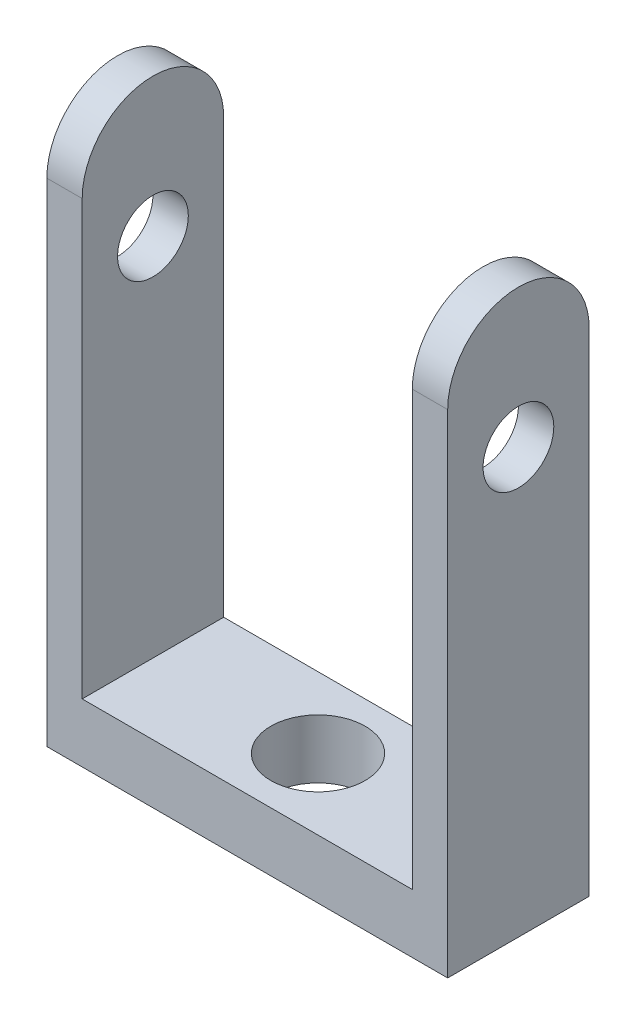
ISO-10303-21;
HEADER;
FILE_DESCRIPTION(('STEP AP214'),'2;1');
FILE_NAME('part.step','',(''),(''),'','','');
FILE_SCHEMA(('AUTOMOTIVE_DESIGN { 1 0 10303 214 1 1 1 1 }'));
ENDSEC;
DATA;
#1=APPLICATION_CONTEXT('core data for automotive mechanical design processes');
#2=APPLICATION_PROTOCOL_DEFINITION('international standard','automotive_design',2000,#1);
#3=PRODUCT_CONTEXT('',#1,'mechanical');
#4=PRODUCT('Part','Part','',(#3));
#5=PRODUCT_RELATED_PRODUCT_CATEGORY('part','',(#4));
#6=PRODUCT_DEFINITION_FORMATION('','',#4);
#7=PRODUCT_DEFINITION_CONTEXT('part definition',#1,'design');
#8=PRODUCT_DEFINITION('design','',#6,#7);
#9=PRODUCT_DEFINITION_SHAPE('','',#8);
#10=(LENGTH_UNIT() NAMED_UNIT(*) SI_UNIT(.MILLI.,.METRE.));
#11=(NAMED_UNIT(*) PLANE_ANGLE_UNIT() SI_UNIT($,.RADIAN.));
#12=(NAMED_UNIT(*) SI_UNIT($,.STERADIAN.) SOLID_ANGLE_UNIT());
#13=UNCERTAINTY_MEASURE_WITH_UNIT(LENGTH_MEASURE(1.E-05),#10,'distance_accuracy_value','');
#14=(GEOMETRIC_REPRESENTATION_CONTEXT(3) GLOBAL_UNCERTAINTY_ASSIGNED_CONTEXT((#13)) GLOBAL_UNIT_ASSIGNED_CONTEXT((#10,
#11,#12)) REPRESENTATION_CONTEXT('',''));
#15=CARTESIAN_POINT('',(0.,0.,0.));
#16=DIRECTION('',(0.,0.,1.));
#17=DIRECTION('',(1.,0.,0.));
#18=AXIS2_PLACEMENT_3D('',#15,#16,#17);
#19=CARTESIAN_POINT('',(17.,5.,6.));
#20=DIRECTION('',(-1.,0.,0.));
#21=DIRECTION('',(0.,0.,1.));
#22=AXIS2_PLACEMENT_3D('',#19,#20,#21);
#23=PLANE('',#22);
#24=DIRECTION('',(0.,0.,-1.));
#25=VECTOR('',#24,1.);
#26=CARTESIAN_POINT('',(17.,0.,6.));
#27=LINE('',#26,#25);
#28=CARTESIAN_POINT('',(17.,0.,6.));
#29=VERTEX_POINT('',#28);
#30=CARTESIAN_POINT('',(17.,0.,-6.));
#31=VERTEX_POINT('',#30);
#32=EDGE_CURVE('E179',#29,#31,#27,.T.);
#33=ORIENTED_EDGE('',*,*,#32,.T.);
#34=DIRECTION('',(0.,-1.,0.));
#35=VECTOR('',#34,1.);
#36=CARTESIAN_POINT('',(17.,5.,-6.));
#37=LINE('',#36,#35);
#38=CARTESIAN_POINT('',(17.,41.7522367722957,-6.));
#39=VERTEX_POINT('',#38);
#40=EDGE_CURVE('E11',#39,#31,#37,.T.);
#41=ORIENTED_EDGE('',*,*,#40,.F.);
#42=CARTESIAN_POINT('',(17.,41.7522367722957,0.));
#43=DIRECTION('',(1.,0.,0.));
#44=DIRECTION('',(0.,0.,1.));
#45=AXIS2_PLACEMENT_3D('',#42,#43,#44);
#46=CIRCLE('',#45,6.);
#47=CARTESIAN_POINT('',(17.,41.7522367722957,6.));
#48=VERTEX_POINT('',#47);
#49=EDGE_CURVE('E155',#39,#48,#46,.T.);
#50=ORIENTED_EDGE('',*,*,#49,.T.);
#51=DIRECTION('',(0.,-1.,0.));
#52=VECTOR('',#51,1.);
#53=CARTESIAN_POINT('',(17.,5.,6.));
#54=LINE('',#53,#52);
#55=EDGE_CURVE('E188',#48,#29,#54,.T.);
#56=ORIENTED_EDGE('',*,*,#55,.T.);
#57=EDGE_LOOP('',(#33,#41,#50,#56));
#58=FACE_BOUND('',#57,.T.);
#59=CARTESIAN_POINT('',(17.,36.,0.));
#60=DIRECTION('',(1.,0.,0.));
#61=DIRECTION('',(0.,0.,-1.));
#62=AXIS2_PLACEMENT_3D('',#59,#60,#61);
#63=CIRCLE('',#62,3.);
#64=CARTESIAN_POINT('',(17.,36.,-3.));
#65=VERTEX_POINT('',#64);
#66=EDGE_CURVE('E147',#65,#65,#63,.T.);
#67=ORIENTED_EDGE('',*,*,#66,.F.);
#68=EDGE_LOOP('',(#67));
#69=FACE_BOUND('',#68,.T.);
#70=ADVANCED_FACE('F39',(#58,#69),#23,.F.);
#71=CARTESIAN_POINT('',(-17.,5.,-6.));
#72=DIRECTION('',(0.,0.,1.));
#73=DIRECTION('',(1.,0.,0.));
#74=AXIS2_PLACEMENT_3D('',#71,#72,#73);
#75=PLANE('',#74);
#76=DIRECTION('',(-1.,0.,0.));
#77=VECTOR('',#76,1.);
#78=CARTESIAN_POINT('',(-17.,0.,-6.));
#79=LINE('',#78,#77);
#80=CARTESIAN_POINT('',(-17.,0.,-6.));
#81=VERTEX_POINT('',#80);
#82=EDGE_CURVE('E192',#31,#81,#79,.T.);
#83=ORIENTED_EDGE('',*,*,#82,.T.);
#84=DIRECTION('',(0.,-1.,0.));
#85=VECTOR('',#84,1.);
#86=CARTESIAN_POINT('',(-17.,5.,-6.));
#87=LINE('',#86,#85);
#88=CARTESIAN_POINT('',(-17.,41.7522367722957,-6.));
#89=VERTEX_POINT('',#88);
#90=EDGE_CURVE('E47',#89,#81,#87,.T.);
#91=ORIENTED_EDGE('',*,*,#90,.F.);
#92=DIRECTION('',(-1.,0.,0.));
#93=VECTOR('',#92,1.);
#94=CARTESIAN_POINT('',(-14.,41.7522367722957,-6.));
#95=LINE('',#94,#93);
#96=CARTESIAN_POINT('',(-14.,41.7522367722957,-6.));
#97=VERTEX_POINT('',#96);
#98=EDGE_CURVE('E133',#97,#89,#95,.T.);
#99=ORIENTED_EDGE('',*,*,#98,.F.);
#100=DIRECTION('',(0.,1.,0.));
#101=VECTOR('',#100,1.);
#102=CARTESIAN_POINT('',(-14.,41.7522367722957,-6.));
#103=LINE('',#102,#101);
#104=CARTESIAN_POINT('',(-14.,5.,-6.));
#105=VERTEX_POINT('',#104);
#106=EDGE_CURVE('E123',#105,#97,#103,.T.);
#107=ORIENTED_EDGE('',*,*,#106,.F.);
#108=DIRECTION('',(-1.,0.,0.));
#109=VECTOR('',#108,1.);
#110=CARTESIAN_POINT('',(-17.,5.,-6.));
#111=LINE('',#110,#109);
#112=CARTESIAN_POINT('',(14.,5.,-6.));
#113=VERTEX_POINT('',#112);
#114=EDGE_CURVE('E54',#113,#105,#111,.T.);
#115=ORIENTED_EDGE('',*,*,#114,.F.);
#116=DIRECTION('',(0.,1.,0.));
#117=VECTOR('',#116,1.);
#118=CARTESIAN_POINT('',(14.,5.,-6.));
#119=LINE('',#118,#117);
#120=CARTESIAN_POINT('',(14.,41.7522367722957,-6.));
#121=VERTEX_POINT('',#120);
#122=EDGE_CURVE('E62',#113,#121,#119,.T.);
#123=ORIENTED_EDGE('',*,*,#122,.T.);
#124=DIRECTION('',(1.,0.,0.));
#125=VECTOR('',#124,1.);
#126=CARTESIAN_POINT('',(14.,41.7522367722957,-6.));
#127=LINE('',#126,#125);
#128=EDGE_CURVE('E171',#121,#39,#127,.T.);
#129=ORIENTED_EDGE('',*,*,#128,.T.);
#130=ORIENTED_EDGE('',*,*,#40,.T.);
#131=EDGE_LOOP('',(#83,#91,#99,#107,#115,#123,#129,#130));
#132=FACE_BOUND('',#131,.T.);
#133=ADVANCED_FACE('F225',(#132),#75,.F.);
#134=CARTESIAN_POINT('',(-17.,5.,6.));
#135=DIRECTION('',(1.,0.,0.));
#136=DIRECTION('',(0.,0.,-1.));
#137=AXIS2_PLACEMENT_3D('',#134,#135,#136);
#138=PLANE('',#137);
#139=DIRECTION('',(0.,0.,1.));
#140=VECTOR('',#139,1.);
#141=CARTESIAN_POINT('',(-17.,0.,6.));
#142=LINE('',#141,#140);
#143=CARTESIAN_POINT('',(-17.,0.,6.));
#144=VERTEX_POINT('',#143);
#145=EDGE_CURVE('E195',#81,#144,#142,.T.);
#146=ORIENTED_EDGE('',*,*,#145,.T.);
#147=DIRECTION('',(0.,-1.,0.));
#148=VECTOR('',#147,1.);
#149=CARTESIAN_POINT('',(-17.,5.,6.));
#150=LINE('',#149,#148);
#151=CARTESIAN_POINT('',(-17.,41.7522367722957,6.));
#152=VERTEX_POINT('',#151);
#153=EDGE_CURVE('E203',#152,#144,#150,.T.);
#154=ORIENTED_EDGE('',*,*,#153,.F.);
#155=CARTESIAN_POINT('',(-17.,41.7522367722957,0.));
#156=DIRECTION('',(1.,0.,0.));
#157=DIRECTION('',(0.,0.,1.));
#158=AXIS2_PLACEMENT_3D('',#155,#156,#157);
#159=CIRCLE('',#158,6.);
#160=EDGE_CURVE('E118',#89,#152,#159,.T.);
#161=ORIENTED_EDGE('',*,*,#160,.F.);
#162=ORIENTED_EDGE('',*,*,#90,.T.);
#163=EDGE_LOOP('',(#146,#154,#161,#162));
#164=FACE_BOUND('',#163,.T.);
#165=CARTESIAN_POINT('',(-17.,36.,0.));
#166=DIRECTION('',(1.,0.,0.));
#167=DIRECTION('',(0.,0.,-1.));
#168=AXIS2_PLACEMENT_3D('',#165,#166,#167);
#169=CIRCLE('',#168,3.);
#170=CARTESIAN_POINT('',(-17.,36.,-3.));
#171=VERTEX_POINT('',#170);
#172=EDGE_CURVE('E232',#171,#171,#169,.T.);
#173=ORIENTED_EDGE('',*,*,#172,.T.);
#174=EDGE_LOOP('',(#173));
#175=FACE_BOUND('',#174,.T.);
#176=ADVANCED_FACE('F209',(#164,#175),#138,.F.);
#177=CARTESIAN_POINT('',(-17.,5.,6.));
#178=DIRECTION('',(0.,0.,-1.));
#179=DIRECTION('',(-1.,0.,0.));
#180=AXIS2_PLACEMENT_3D('',#177,#178,#179);
#181=PLANE('',#180);
#182=DIRECTION('',(1.,0.,0.));
#183=VECTOR('',#182,1.);
#184=CARTESIAN_POINT('',(-17.,0.,6.));
#185=LINE('',#184,#183);
#186=EDGE_CURVE('E185',#144,#29,#185,.T.);
#187=ORIENTED_EDGE('',*,*,#186,.T.);
#188=ORIENTED_EDGE('',*,*,#55,.F.);
#189=DIRECTION('',(1.,0.,0.));
#190=VECTOR('',#189,1.);
#191=CARTESIAN_POINT('',(14.,41.7522367722957,6.));
#192=LINE('',#191,#190);
#193=CARTESIAN_POINT('',(14.,41.7522367722957,6.));
#194=VERTEX_POINT('',#193);
#195=EDGE_CURVE('E175',#194,#48,#192,.T.);
#196=ORIENTED_EDGE('',*,*,#195,.F.);
#197=DIRECTION('',(0.,-1.,0.));
#198=VECTOR('',#197,1.);
#199=CARTESIAN_POINT('',(14.,5.,6.));
#200=LINE('',#199,#198);
#201=CARTESIAN_POINT('',(14.,5.,6.));
#202=VERTEX_POINT('',#201);
#203=EDGE_CURVE('E159',#194,#202,#200,.T.);
#204=ORIENTED_EDGE('',*,*,#203,.T.);
#205=DIRECTION('',(1.,0.,0.));
#206=VECTOR('',#205,1.);
#207=CARTESIAN_POINT('',(-17.,5.,6.));
#208=LINE('',#207,#206);
#209=CARTESIAN_POINT('',(-14.,5.,6.));
#210=VERTEX_POINT('',#209);
#211=EDGE_CURVE('E113',#210,#202,#208,.T.);
#212=ORIENTED_EDGE('',*,*,#211,.F.);
#213=DIRECTION('',(0.,-1.,0.));
#214=VECTOR('',#213,1.);
#215=CARTESIAN_POINT('',(-14.,5.,6.));
#216=LINE('',#215,#214);
#217=CARTESIAN_POINT('',(-14.,41.7522367722957,6.));
#218=VERTEX_POINT('',#217);
#219=EDGE_CURVE('E106',#218,#210,#216,.T.);
#220=ORIENTED_EDGE('',*,*,#219,.F.);
#221=DIRECTION('',(-1.,0.,0.));
#222=VECTOR('',#221,1.);
#223=CARTESIAN_POINT('',(-14.,41.7522367722957,6.));
#224=LINE('',#223,#222);
#225=EDGE_CURVE('E111',#218,#152,#224,.T.);
#226=ORIENTED_EDGE('',*,*,#225,.T.);
#227=ORIENTED_EDGE('',*,*,#153,.T.);
#228=EDGE_LOOP('',(#187,#188,#196,#204,#212,#220,#226,#227));
#229=FACE_BOUND('',#228,.T.);
#230=ADVANCED_FACE('F108',(#229),#181,.F.);
#231=CARTESIAN_POINT('',(0.,5.,0.));
#232=DIRECTION('',(0.,-1.,0.));
#233=DIRECTION('',(0.,0.,-1.));
#234=AXIS2_PLACEMENT_3D('',#231,#232,#233);
#235=PLANE('',#234);
#236=CARTESIAN_POINT('',(0.,5.,0.));
#237=DIRECTION('',(0.,1.,0.));
#238=DIRECTION('',(0.,0.,1.));
#239=AXIS2_PLACEMENT_3D('',#236,#237,#238);
#240=CIRCLE('',#239,4.);
#241=CARTESIAN_POINT('',(0.,5.,4.));
#242=VERTEX_POINT('',#241);
#243=EDGE_CURVE('E138',#242,#242,#240,.T.);
#244=ORIENTED_EDGE('',*,*,#243,.F.);
#245=EDGE_LOOP('',(#244));
#246=FACE_BOUND('',#245,.T.);
#247=ORIENTED_EDGE('',*,*,#114,.T.);
#248=DIRECTION('',(0.,0.,-1.));
#249=VECTOR('',#248,1.);
#250=CARTESIAN_POINT('',(-14.,5.,6.));
#251=LINE('',#250,#249);
#252=EDGE_CURVE('E134',#210,#105,#251,.T.);
#253=ORIENTED_EDGE('',*,*,#252,.F.);
#254=ORIENTED_EDGE('',*,*,#211,.T.);
#255=DIRECTION('',(0.,0.,-1.));
#256=VECTOR('',#255,1.);
#257=CARTESIAN_POINT('',(14.,5.,6.));
#258=LINE('',#257,#256);
#259=EDGE_CURVE('E162',#202,#113,#258,.T.);
#260=ORIENTED_EDGE('',*,*,#259,.T.);
#261=EDGE_LOOP('',(#247,#253,#254,#260));
#262=FACE_BOUND('',#261,.T.);
#263=ADVANCED_FACE('F224',(#246,#262),#235,.F.);
#264=CARTESIAN_POINT('',(0.,0.,0.));
#265=DIRECTION('',(0.,-1.,0.));
#266=DIRECTION('',(0.,0.,-1.));
#267=AXIS2_PLACEMENT_3D('',#264,#265,#266);
#268=PLANE('',#267);
#269=CARTESIAN_POINT('',(0.,0.,0.));
#270=DIRECTION('',(0.,1.,0.));
#271=DIRECTION('',(0.,0.,1.));
#272=AXIS2_PLACEMENT_3D('',#269,#270,#271);
#273=CIRCLE('',#272,4.);
#274=CARTESIAN_POINT('',(0.,0.,4.));
#275=VERTEX_POINT('',#274);
#276=EDGE_CURVE('E143',#275,#275,#273,.T.);
#277=ORIENTED_EDGE('',*,*,#276,.T.);
#278=EDGE_LOOP('',(#277));
#279=FACE_BOUND('',#278,.T.);
#280=ORIENTED_EDGE('',*,*,#32,.F.);
#281=ORIENTED_EDGE('',*,*,#186,.F.);
#282=ORIENTED_EDGE('',*,*,#145,.F.);
#283=ORIENTED_EDGE('',*,*,#82,.F.);
#284=EDGE_LOOP('',(#280,#281,#282,#283));
#285=FACE_BOUND('',#284,.T.);
#286=ADVANCED_FACE('F215',(#279,#285),#268,.T.);
#287=CARTESIAN_POINT('',(14.,41.7522367722957,0.));
#288=DIRECTION('',(1.,0.,0.));
#289=DIRECTION('',(0.,0.,-1.));
#290=AXIS2_PLACEMENT_3D('',#287,#288,#289);
#291=CYLINDRICAL_SURFACE('',#290,6.);
#292=ORIENTED_EDGE('',*,*,#49,.F.);
#293=ORIENTED_EDGE('',*,*,#128,.F.);
#294=CARTESIAN_POINT('',(14.,41.7522367722957,0.));
#295=DIRECTION('',(1.,0.,0.));
#296=DIRECTION('',(0.,0.,1.));
#297=AXIS2_PLACEMENT_3D('',#294,#295,#296);
#298=CIRCLE('',#297,6.);
#299=EDGE_CURVE('E167',#121,#194,#298,.T.);
#300=ORIENTED_EDGE('',*,*,#299,.T.);
#301=ORIENTED_EDGE('',*,*,#195,.T.);
#302=EDGE_LOOP('',(#292,#293,#300,#301));
#303=FACE_BOUND('',#302,.T.);
#304=ADVANCED_FACE('F222',(#303),#291,.T.);
#305=CARTESIAN_POINT('',(14.,41.7522367722957,0.));
#306=DIRECTION('',(-1.,0.,0.));
#307=DIRECTION('',(0.,0.,1.));
#308=AXIS2_PLACEMENT_3D('',#305,#306,#307);
#309=PLANE('',#308);
#310=CARTESIAN_POINT('',(14.,36.,0.));
#311=DIRECTION('',(1.,0.,0.));
#312=DIRECTION('',(0.,0.,-1.));
#313=AXIS2_PLACEMENT_3D('',#310,#311,#312);
#314=CIRCLE('',#313,3.);
#315=CARTESIAN_POINT('',(14.,36.,-3.));
#316=VERTEX_POINT('',#315);
#317=EDGE_CURVE('E151',#316,#316,#314,.T.);
#318=ORIENTED_EDGE('',*,*,#317,.T.);
#319=EDGE_LOOP('',(#318));
#320=FACE_BOUND('',#319,.T.);
#321=ORIENTED_EDGE('',*,*,#203,.F.);
#322=ORIENTED_EDGE('',*,*,#299,.F.);
#323=ORIENTED_EDGE('',*,*,#122,.F.);
#324=ORIENTED_EDGE('',*,*,#259,.F.);
#325=EDGE_LOOP('',(#321,#322,#323,#324));
#326=FACE_BOUND('',#325,.T.);
#327=ADVANCED_FACE('F223',(#320,#326),#309,.T.);
#328=CARTESIAN_POINT('',(14.,36.,0.));
#329=DIRECTION('',(1.,0.,0.));
#330=DIRECTION('',(0.,0.,-1.));
#331=AXIS2_PLACEMENT_3D('',#328,#329,#330);
#332=CYLINDRICAL_SURFACE('',#331,3.);
#333=ORIENTED_EDGE('',*,*,#317,.F.);
#334=EDGE_LOOP('',(#333));
#335=FACE_BOUND('',#334,.T.);
#336=ORIENTED_EDGE('',*,*,#66,.T.);
#337=EDGE_LOOP('',(#336));
#338=FACE_BOUND('',#337,.T.);
#339=ADVANCED_FACE('F270',(#335,#338),#332,.F.);
#340=CARTESIAN_POINT('',(0.,0.,0.));
#341=DIRECTION('',(0.,1.,0.));
#342=DIRECTION('',(0.,0.,1.));
#343=AXIS2_PLACEMENT_3D('',#340,#341,#342);
#344=CYLINDRICAL_SURFACE('',#343,4.);
#345=ORIENTED_EDGE('',*,*,#276,.F.);
#346=EDGE_LOOP('',(#345));
#347=FACE_BOUND('',#346,.T.);
#348=ORIENTED_EDGE('',*,*,#243,.T.);
#349=EDGE_LOOP('',(#348));
#350=FACE_BOUND('',#349,.T.);
#351=ADVANCED_FACE('F274',(#347,#350),#344,.F.);
#352=CARTESIAN_POINT('',(-14.,41.7522367722957,0.));
#353=DIRECTION('',(1.,0.,0.));
#354=DIRECTION('',(0.,0.,1.));
#355=AXIS2_PLACEMENT_3D('',#352,#353,#354);
#356=PLANE('',#355);
#357=ORIENTED_EDGE('',*,*,#219,.T.);
#358=ORIENTED_EDGE('',*,*,#252,.T.);
#359=ORIENTED_EDGE('',*,*,#106,.T.);
#360=CARTESIAN_POINT('',(-14.,41.7522367722957,0.));
#361=DIRECTION('',(1.,0.,0.));
#362=DIRECTION('',(0.,0.,1.));
#363=AXIS2_PLACEMENT_3D('',#360,#361,#362);
#364=CIRCLE('',#363,6.);
#365=EDGE_CURVE('E117',#97,#218,#364,.T.);
#366=ORIENTED_EDGE('',*,*,#365,.T.);
#367=EDGE_LOOP('',(#357,#358,#359,#366));
#368=FACE_BOUND('',#367,.T.);
#369=CARTESIAN_POINT('',(-14.,36.,0.));
#370=DIRECTION('',(1.,0.,0.));
#371=DIRECTION('',(0.,0.,-1.));
#372=AXIS2_PLACEMENT_3D('',#369,#370,#371);
#373=CIRCLE('',#372,3.);
#374=CARTESIAN_POINT('',(-14.,36.,-3.));
#375=VERTEX_POINT('',#374);
#376=EDGE_CURVE('E229',#375,#375,#373,.T.);
#377=ORIENTED_EDGE('',*,*,#376,.F.);
#378=EDGE_LOOP('',(#377));
#379=FACE_BOUND('',#378,.T.);
#380=ADVANCED_FACE('F121',(#368,#379),#356,.T.);
#381=CARTESIAN_POINT('',(-14.,41.7522367722957,0.));
#382=DIRECTION('',(-1.,0.,0.));
#383=DIRECTION('',(0.,0.,1.));
#384=AXIS2_PLACEMENT_3D('',#381,#382,#383);
#385=CYLINDRICAL_SURFACE('',#384,6.);
#386=ORIENTED_EDGE('',*,*,#160,.T.);
#387=ORIENTED_EDGE('',*,*,#225,.F.);
#388=ORIENTED_EDGE('',*,*,#365,.F.);
#389=ORIENTED_EDGE('',*,*,#98,.T.);
#390=EDGE_LOOP('',(#386,#387,#388,#389));
#391=FACE_BOUND('',#390,.T.);
#392=ADVANCED_FACE('F130',(#391),#385,.T.);
#393=CARTESIAN_POINT('',(-14.,36.,0.));
#394=DIRECTION('',(-1.,0.,0.));
#395=DIRECTION('',(0.,0.,1.));
#396=AXIS2_PLACEMENT_3D('',#393,#394,#395);
#397=CYLINDRICAL_SURFACE('',#396,3.);
#398=ORIENTED_EDGE('',*,*,#376,.T.);
#399=EDGE_LOOP('',(#398));
#400=FACE_BOUND('',#399,.T.);
#401=ORIENTED_EDGE('',*,*,#172,.F.);
#402=EDGE_LOOP('',(#401));
#403=FACE_BOUND('',#402,.T.);
#404=ADVANCED_FACE('F241',(#400,#403),#397,.F.);
#405=CLOSED_SHELL('',(#70,#133,#176,#230,#263,#286,#304,#327,#339,#351,#380,#392,#404));
#406=MANIFOLD_SOLID_BREP('B2',#405);
#407=ADVANCED_BREP_SHAPE_REPRESENTATION('',(#18,#406),#14);
#408=SHAPE_DEFINITION_REPRESENTATION(#9,#407);
ENDSEC;
END-ISO-10303-21;
